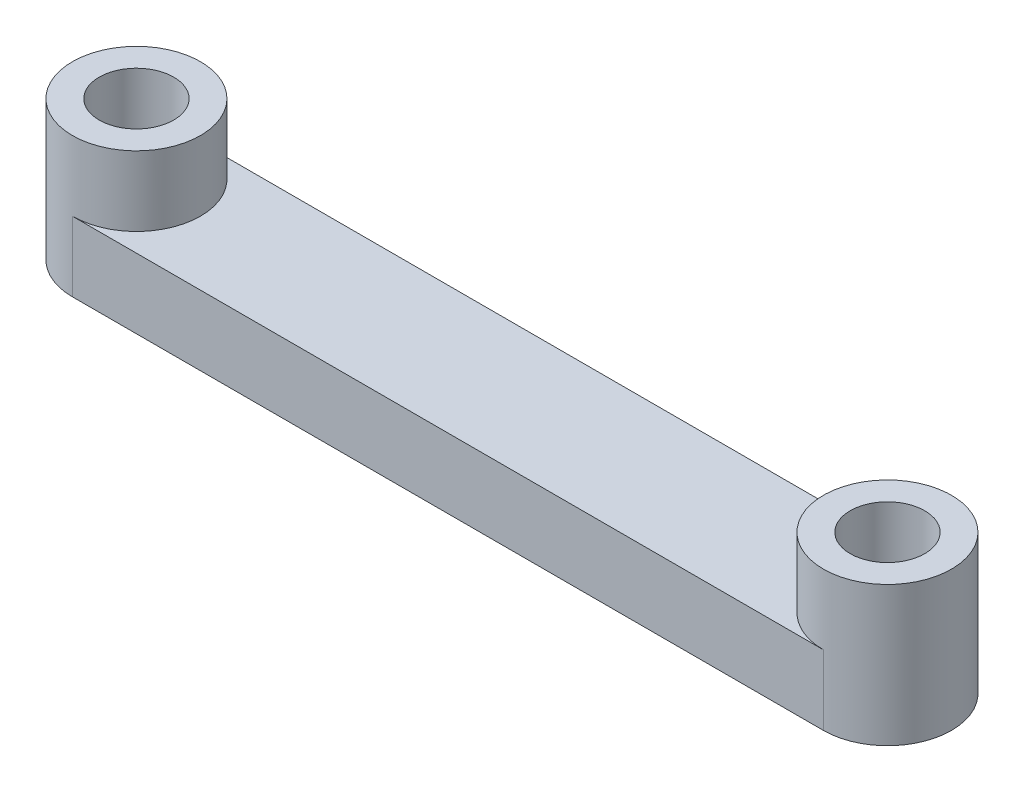
ISO-10303-21;
HEADER;
FILE_DESCRIPTION(('STEP AP214'),'2;1');
FILE_NAME('part.step','',(''),(''),'','','');
FILE_SCHEMA(('AUTOMOTIVE_DESIGN { 1 0 10303 214 1 1 1 1 }'));
ENDSEC;
DATA;
#1=APPLICATION_CONTEXT('core data for automotive mechanical design processes');
#2=APPLICATION_PROTOCOL_DEFINITION('international standard','automotive_design',2000,#1);
#3=PRODUCT_CONTEXT('',#1,'mechanical');
#4=PRODUCT('Part','Part','',(#3));
#5=PRODUCT_RELATED_PRODUCT_CATEGORY('part','',(#4));
#6=PRODUCT_DEFINITION_FORMATION('','',#4);
#7=PRODUCT_DEFINITION_CONTEXT('part definition',#1,'design');
#8=PRODUCT_DEFINITION('design','',#6,#7);
#9=PRODUCT_DEFINITION_SHAPE('','',#8);
#10=(LENGTH_UNIT() NAMED_UNIT(*) SI_UNIT(.MILLI.,.METRE.));
#11=(NAMED_UNIT(*) PLANE_ANGLE_UNIT() SI_UNIT($,.RADIAN.));
#12=(NAMED_UNIT(*) SI_UNIT($,.STERADIAN.) SOLID_ANGLE_UNIT());
#13=UNCERTAINTY_MEASURE_WITH_UNIT(LENGTH_MEASURE(1.E-05),#10,'distance_accuracy_value','');
#14=(GEOMETRIC_REPRESENTATION_CONTEXT(3) GLOBAL_UNCERTAINTY_ASSIGNED_CONTEXT((#13)) GLOBAL_UNIT_ASSIGNED_CONTEXT((#10,
#11,#12)) REPRESENTATION_CONTEXT('',''));
#15=CARTESIAN_POINT('',(0.,0.,0.));
#16=DIRECTION('',(0.,0.,1.));
#17=DIRECTION('',(1.,0.,0.));
#18=AXIS2_PLACEMENT_3D('',#15,#16,#17);
#19=CARTESIAN_POINT('',(32.26,3.,0.));
#20=DIRECTION('',(0.,-1.,0.));
#21=DIRECTION('',(0.,0.,-1.));
#22=AXIS2_PLACEMENT_3D('',#19,#20,#21);
#23=CYLINDRICAL_SURFACE('',#22,2.75);
#24=CARTESIAN_POINT('',(32.26,0.,0.));
#25=DIRECTION('',(0.,1.,0.));
#26=DIRECTION('',(0.,0.,1.));
#27=AXIS2_PLACEMENT_3D('',#24,#25,#26);
#28=CIRCLE('',#27,2.75);
#29=CARTESIAN_POINT('',(32.26,0.,2.75));
#30=VERTEX_POINT('',#29);
#31=CARTESIAN_POINT('',(32.26,0.,-2.75));
#32=VERTEX_POINT('',#31);
#33=EDGE_CURVE('E96',#30,#32,#28,.T.);
#34=ORIENTED_EDGE('',*,*,#33,.T.);
#35=DIRECTION('',(0.,-1.,0.));
#36=VECTOR('',#35,1.);
#37=CARTESIAN_POINT('',(32.26,3.,-2.75));
#38=LINE('',#37,#36);
#39=CARTESIAN_POINT('',(32.26,3.,-2.75));
#40=VERTEX_POINT('',#39);
#41=EDGE_CURVE('E44',#40,#32,#38,.T.);
#42=ORIENTED_EDGE('',*,*,#41,.F.);
#43=CARTESIAN_POINT('',(32.26,3.,0.));
#44=DIRECTION('',(0.,1.,0.));
#45=DIRECTION('',(0.,0.,1.));
#46=AXIS2_PLACEMENT_3D('',#43,#44,#45);
#47=CIRCLE('',#46,2.75);
#48=CARTESIAN_POINT('',(32.26,3.,2.75));
#49=VERTEX_POINT('',#48);
#50=EDGE_CURVE('E11',#40,#49,#47,.T.);
#51=ORIENTED_EDGE('',*,*,#50,.T.);
#52=DIRECTION('',(0.,-1.,0.));
#53=VECTOR('',#52,1.);
#54=CARTESIAN_POINT('',(32.26,3.,2.75));
#55=LINE('',#54,#53);
#56=EDGE_CURVE('E85',#49,#30,#55,.T.);
#57=ORIENTED_EDGE('',*,*,#56,.T.);
#58=EDGE_LOOP('',(#34,#42,#51,#57));
#59=FACE_BOUND('',#58,.T.);
#60=CARTESIAN_POINT('',(32.26,6.,0.));
#61=DIRECTION('',(0.,1.,0.));
#62=DIRECTION('',(0.,0.,1.));
#63=AXIS2_PLACEMENT_3D('',#60,#61,#62);
#64=CIRCLE('',#63,2.75);
#65=CARTESIAN_POINT('',(32.26,6.,2.75));
#66=VERTEX_POINT('',#65);
#67=EDGE_CURVE('E128',#66,#66,#64,.T.);
#68=ORIENTED_EDGE('',*,*,#67,.F.);
#69=EDGE_LOOP('',(#68));
#70=FACE_BOUND('',#69,.T.);
#71=ADVANCED_FACE('F41',(#59,#70),#23,.T.);
#72=CARTESIAN_POINT('',(0.,3.,-2.75));
#73=DIRECTION('',(0.,0.,-1.));
#74=DIRECTION('',(-1.,0.,0.));
#75=AXIS2_PLACEMENT_3D('',#72,#73,#74);
#76=PLANE('',#75);
#77=DIRECTION('',(1.,0.,0.));
#78=VECTOR('',#77,1.);
#79=CARTESIAN_POINT('',(0.,0.,-2.75));
#80=LINE('',#79,#78);
#81=CARTESIAN_POINT('',(0.,0.,-2.75));
#82=VERTEX_POINT('',#81);
#83=EDGE_CURVE('E102',#82,#32,#80,.T.);
#84=ORIENTED_EDGE('',*,*,#83,.F.);
#85=DIRECTION('',(0.,-1.,0.));
#86=VECTOR('',#85,1.);
#87=CARTESIAN_POINT('',(0.,3.,-2.75));
#88=LINE('',#87,#86);
#89=CARTESIAN_POINT('',(0.,3.,-2.75));
#90=VERTEX_POINT('',#89);
#91=EDGE_CURVE('E58',#90,#82,#88,.T.);
#92=ORIENTED_EDGE('',*,*,#91,.F.);
#93=DIRECTION('',(1.,0.,0.));
#94=VECTOR('',#93,1.);
#95=CARTESIAN_POINT('',(0.,3.,-2.75));
#96=LINE('',#95,#94);
#97=EDGE_CURVE('E117',#90,#40,#96,.T.);
#98=ORIENTED_EDGE('',*,*,#97,.T.);
#99=ORIENTED_EDGE('',*,*,#41,.T.);
#100=EDGE_LOOP('',(#84,#92,#98,#99));
#101=FACE_BOUND('',#100,.T.);
#102=ADVANCED_FACE('F120',(#101),#76,.T.);
#103=CARTESIAN_POINT('',(0.,3.,0.));
#104=DIRECTION('',(0.,-1.,0.));
#105=DIRECTION('',(0.,0.,-1.));
#106=AXIS2_PLACEMENT_3D('',#103,#104,#105);
#107=CYLINDRICAL_SURFACE('',#106,2.75);
#108=CARTESIAN_POINT('',(0.,0.,0.));
#109=DIRECTION('',(0.,1.,0.));
#110=DIRECTION('',(0.,0.,1.));
#111=AXIS2_PLACEMENT_3D('',#108,#109,#110);
#112=CIRCLE('',#111,2.75);
#113=CARTESIAN_POINT('',(0.,0.,2.75));
#114=VERTEX_POINT('',#113);
#115=EDGE_CURVE('E74',#82,#114,#112,.T.);
#116=ORIENTED_EDGE('',*,*,#115,.T.);
#117=DIRECTION('',(0.,-1.,0.));
#118=VECTOR('',#117,1.);
#119=CARTESIAN_POINT('',(0.,3.,2.75));
#120=LINE('',#119,#118);
#121=CARTESIAN_POINT('',(0.,3.,2.75));
#122=VERTEX_POINT('',#121);
#123=EDGE_CURVE('E87',#122,#114,#120,.T.);
#124=ORIENTED_EDGE('',*,*,#123,.F.);
#125=CARTESIAN_POINT('',(0.,3.,0.));
#126=DIRECTION('',(0.,1.,0.));
#127=DIRECTION('',(0.,0.,1.));
#128=AXIS2_PLACEMENT_3D('',#125,#126,#127);
#129=CIRCLE('',#128,2.75);
#130=EDGE_CURVE('E107',#122,#90,#129,.T.);
#131=ORIENTED_EDGE('',*,*,#130,.T.);
#132=ORIENTED_EDGE('',*,*,#91,.T.);
#133=EDGE_LOOP('',(#116,#124,#131,#132));
#134=FACE_BOUND('',#133,.T.);
#135=CARTESIAN_POINT('',(0.,6.,0.));
#136=DIRECTION('',(0.,1.,0.));
#137=DIRECTION('',(0.,0.,1.));
#138=AXIS2_PLACEMENT_3D('',#135,#136,#137);
#139=CIRCLE('',#138,2.75);
#140=CARTESIAN_POINT('',(0.,6.,2.75));
#141=VERTEX_POINT('',#140);
#142=EDGE_CURVE('E103',#141,#141,#139,.T.);
#143=ORIENTED_EDGE('',*,*,#142,.F.);
#144=EDGE_LOOP('',(#143));
#145=FACE_BOUND('',#144,.T.);
#146=ADVANCED_FACE('F152',(#134,#145),#107,.T.);
#147=CARTESIAN_POINT('',(0.,3.,0.));
#148=DIRECTION('',(0.,-1.,0.));
#149=DIRECTION('',(0.,0.,-1.));
#150=AXIS2_PLACEMENT_3D('',#147,#148,#149);
#151=CYLINDRICAL_SURFACE('',#150,1.6);
#152=CARTESIAN_POINT('',(0.,0.,0.));
#153=DIRECTION('',(0.,1.,0.));
#154=DIRECTION('',(0.,0.,1.));
#155=AXIS2_PLACEMENT_3D('',#152,#153,#154);
#156=CIRCLE('',#155,1.6);
#157=CARTESIAN_POINT('',(0.,0.,1.6));
#158=VERTEX_POINT('',#157);
#159=EDGE_CURVE('E90',#158,#158,#156,.T.);
#160=ORIENTED_EDGE('',*,*,#159,.F.);
#161=EDGE_LOOP('',(#160));
#162=FACE_BOUND('',#161,.T.);
#163=CARTESIAN_POINT('',(0.,6.,0.));
#164=DIRECTION('',(0.,1.,0.));
#165=DIRECTION('',(0.,0.,1.));
#166=AXIS2_PLACEMENT_3D('',#163,#164,#165);
#167=CIRCLE('',#166,1.6);
#168=CARTESIAN_POINT('',(0.,6.,1.6));
#169=VERTEX_POINT('',#168);
#170=EDGE_CURVE('E127',#169,#169,#167,.T.);
#171=ORIENTED_EDGE('',*,*,#170,.T.);
#172=EDGE_LOOP('',(#171));
#173=FACE_BOUND('',#172,.T.);
#174=ADVANCED_FACE('F135',(#162,#173),#151,.F.);
#175=CARTESIAN_POINT('',(0.,3.,2.75));
#176=DIRECTION('',(0.,0.,-1.));
#177=DIRECTION('',(-1.,0.,0.));
#178=AXIS2_PLACEMENT_3D('',#175,#176,#177);
#179=PLANE('',#178);
#180=DIRECTION('',(1.,0.,0.));
#181=VECTOR('',#180,1.);
#182=CARTESIAN_POINT('',(0.,0.,2.75));
#183=LINE('',#182,#181);
#184=EDGE_CURVE('E80',#114,#30,#183,.T.);
#185=ORIENTED_EDGE('',*,*,#184,.T.);
#186=ORIENTED_EDGE('',*,*,#56,.F.);
#187=DIRECTION('',(1.,0.,0.));
#188=VECTOR('',#187,1.);
#189=CARTESIAN_POINT('',(0.,3.,2.75));
#190=LINE('',#189,#188);
#191=EDGE_CURVE('E98',#122,#49,#190,.T.);
#192=ORIENTED_EDGE('',*,*,#191,.F.);
#193=ORIENTED_EDGE('',*,*,#123,.T.);
#194=EDGE_LOOP('',(#185,#186,#192,#193));
#195=FACE_BOUND('',#194,.T.);
#196=ADVANCED_FACE('F82',(#195),#179,.F.);
#197=CARTESIAN_POINT('',(32.26,3.,0.));
#198=DIRECTION('',(0.,-1.,0.));
#199=DIRECTION('',(0.,0.,-1.));
#200=AXIS2_PLACEMENT_3D('',#197,#198,#199);
#201=CYLINDRICAL_SURFACE('',#200,1.6);
#202=CARTESIAN_POINT('',(32.26,0.,0.));
#203=DIRECTION('',(0.,1.,0.));
#204=DIRECTION('',(0.,0.,1.));
#205=AXIS2_PLACEMENT_3D('',#202,#203,#204);
#206=CIRCLE('',#205,1.6);
#207=CARTESIAN_POINT('',(32.26,0.,1.6));
#208=VERTEX_POINT('',#207);
#209=EDGE_CURVE('E115',#208,#208,#206,.T.);
#210=ORIENTED_EDGE('',*,*,#209,.F.);
#211=EDGE_LOOP('',(#210));
#212=FACE_BOUND('',#211,.T.);
#213=CARTESIAN_POINT('',(32.26,6.,0.));
#214=DIRECTION('',(0.,1.,0.));
#215=DIRECTION('',(0.,0.,1.));
#216=AXIS2_PLACEMENT_3D('',#213,#214,#215);
#217=CIRCLE('',#216,1.6);
#218=CARTESIAN_POINT('',(32.26,6.,1.6));
#219=VERTEX_POINT('',#218);
#220=EDGE_CURVE('E124',#219,#219,#217,.T.);
#221=ORIENTED_EDGE('',*,*,#220,.T.);
#222=EDGE_LOOP('',(#221));
#223=FACE_BOUND('',#222,.T.);
#224=ADVANCED_FACE('F160',(#212,#223),#201,.F.);
#225=CARTESIAN_POINT('',(0.,3.,0.));
#226=DIRECTION('',(0.,1.,0.));
#227=DIRECTION('',(0.,0.,1.));
#228=AXIS2_PLACEMENT_3D('',#225,#226,#227);
#229=PLANE('',#228);
#230=ORIENTED_EDGE('',*,*,#130,.F.);
#231=ORIENTED_EDGE('',*,*,#191,.T.);
#232=ORIENTED_EDGE('',*,*,#50,.F.);
#233=ORIENTED_EDGE('',*,*,#97,.F.);
#234=EDGE_LOOP('',(#230,#231,#232,#233));
#235=FACE_BOUND('',#234,.T.);
#236=ADVANCED_FACE('F166',(#235),#229,.T.);
#237=CARTESIAN_POINT('',(0.,0.,0.));
#238=DIRECTION('',(0.,1.,0.));
#239=DIRECTION('',(0.,0.,1.));
#240=AXIS2_PLACEMENT_3D('',#237,#238,#239);
#241=PLANE('',#240);
#242=ORIENTED_EDGE('',*,*,#33,.F.);
#243=ORIENTED_EDGE('',*,*,#184,.F.);
#244=ORIENTED_EDGE('',*,*,#115,.F.);
#245=ORIENTED_EDGE('',*,*,#83,.T.);
#246=EDGE_LOOP('',(#242,#243,#244,#245));
#247=FACE_BOUND('',#246,.T.);
#248=ORIENTED_EDGE('',*,*,#159,.T.);
#249=EDGE_LOOP('',(#248));
#250=FACE_BOUND('',#249,.T.);
#251=ORIENTED_EDGE('',*,*,#209,.T.);
#252=EDGE_LOOP('',(#251));
#253=FACE_BOUND('',#252,.T.);
#254=ADVANCED_FACE('F100',(#247,#250,#253),#241,.F.);
#255=CARTESIAN_POINT('',(32.26,6.,0.));
#256=DIRECTION('',(0.,1.,0.));
#257=DIRECTION('',(0.,0.,1.));
#258=AXIS2_PLACEMENT_3D('',#255,#256,#257);
#259=PLANE('',#258);
#260=ORIENTED_EDGE('',*,*,#67,.T.);
#261=EDGE_LOOP('',(#260));
#262=FACE_BOUND('',#261,.T.);
#263=ORIENTED_EDGE('',*,*,#220,.F.);
#264=EDGE_LOOP('',(#263));
#265=FACE_BOUND('',#264,.T.);
#266=ADVANCED_FACE('F139',(#262,#265),#259,.T.);
#267=CARTESIAN_POINT('',(0.,6.,0.));
#268=DIRECTION('',(0.,1.,0.));
#269=DIRECTION('',(0.,0.,1.));
#270=AXIS2_PLACEMENT_3D('',#267,#268,#269);
#271=PLANE('',#270);
#272=ORIENTED_EDGE('',*,*,#142,.T.);
#273=EDGE_LOOP('',(#272));
#274=FACE_BOUND('',#273,.T.);
#275=ORIENTED_EDGE('',*,*,#170,.F.);
#276=EDGE_LOOP('',(#275));
#277=FACE_BOUND('',#276,.T.);
#278=ADVANCED_FACE('F137',(#274,#277),#271,.T.);
#279=CLOSED_SHELL('',(#71,#102,#146,#174,#196,#224,#236,#254,#266,#278));
#280=MANIFOLD_SOLID_BREP('B2',#279);
#281=ADVANCED_BREP_SHAPE_REPRESENTATION('',(#18,#280),#14);
#282=SHAPE_DEFINITION_REPRESENTATION(#9,#281);
ENDSEC;
END-ISO-10303-21;
